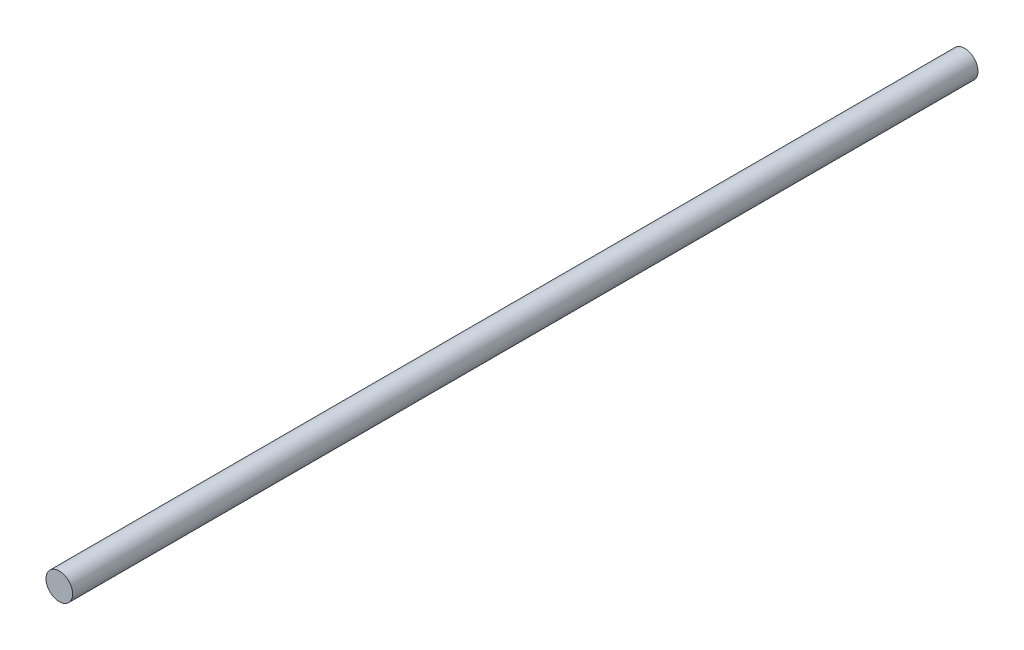
ISO-10303-21;
HEADER;
FILE_DESCRIPTION(('STEP AP214'),'2;1');
FILE_NAME('part.step','',(''),(''),'','','');
FILE_SCHEMA(('AUTOMOTIVE_DESIGN { 1 0 10303 214 1 1 1 1 }'));
ENDSEC;
DATA;
#1=APPLICATION_CONTEXT('core data for automotive mechanical design processes');
#2=APPLICATION_PROTOCOL_DEFINITION('international standard','automotive_design',2000,#1);
#3=PRODUCT_CONTEXT('',#1,'mechanical');
#4=PRODUCT('Part','Part','',(#3));
#5=PRODUCT_RELATED_PRODUCT_CATEGORY('part','',(#4));
#6=PRODUCT_DEFINITION_FORMATION('','',#4);
#7=PRODUCT_DEFINITION_CONTEXT('part definition',#1,'design');
#8=PRODUCT_DEFINITION('design','',#6,#7);
#9=PRODUCT_DEFINITION_SHAPE('','',#8);
#10=(LENGTH_UNIT() NAMED_UNIT(*) SI_UNIT(.MILLI.,.METRE.));
#11=(NAMED_UNIT(*) PLANE_ANGLE_UNIT() SI_UNIT($,.RADIAN.));
#12=(NAMED_UNIT(*) SI_UNIT($,.STERADIAN.) SOLID_ANGLE_UNIT());
#13=UNCERTAINTY_MEASURE_WITH_UNIT(LENGTH_MEASURE(1.E-05),#10,'distance_accuracy_value','');
#14=(GEOMETRIC_REPRESENTATION_CONTEXT(3) GLOBAL_UNCERTAINTY_ASSIGNED_CONTEXT((#13)) GLOBAL_UNIT_ASSIGNED_CONTEXT((#10,
#11,#12)) REPRESENTATION_CONTEXT('',''));
#15=CARTESIAN_POINT('',(0.,0.,0.));
#16=DIRECTION('',(0.,0.,1.));
#17=DIRECTION('',(1.,0.,0.));
#18=AXIS2_PLACEMENT_3D('',#15,#16,#17);
#19=CARTESIAN_POINT('',(0.,0.,170.));
#20=DIRECTION('',(0.,0.,-1.));
#21=DIRECTION('',(-1.,0.,0.));
#22=AXIS2_PLACEMENT_3D('',#19,#20,#21);
#23=CYLINDRICAL_SURFACE('',#22,2.5);
#24=CARTESIAN_POINT('',(0.,0.,170.));
#25=DIRECTION('',(0.,0.,1.));
#26=DIRECTION('',(1.,0.,0.));
#27=AXIS2_PLACEMENT_3D('',#24,#25,#26);
#28=CIRCLE('',#27,2.5);
#29=CARTESIAN_POINT('',(2.5,0.,170.));
#30=VERTEX_POINT('',#29);
#31=EDGE_CURVE('E10',#30,#30,#28,.T.);
#32=ORIENTED_EDGE('',*,*,#31,.F.);
#33=EDGE_LOOP('',(#32));
#34=FACE_BOUND('',#33,.T.);
#35=CARTESIAN_POINT('',(0.,0.,0.));
#36=DIRECTION('',(0.,0.,1.));
#37=DIRECTION('',(1.,0.,0.));
#38=AXIS2_PLACEMENT_3D('',#35,#36,#37);
#39=CIRCLE('',#38,2.5);
#40=CARTESIAN_POINT('',(2.5,0.,0.));
#41=VERTEX_POINT('',#40);
#42=EDGE_CURVE('E34',#41,#41,#39,.T.);
#43=ORIENTED_EDGE('',*,*,#42,.T.);
#44=EDGE_LOOP('',(#43));
#45=FACE_BOUND('',#44,.T.);
#46=ADVANCED_FACE('F31',(#34,#45),#23,.T.);
#47=CARTESIAN_POINT('',(0.,0.,170.));
#48=DIRECTION('',(0.,0.,1.));
#49=DIRECTION('',(1.,0.,0.));
#50=AXIS2_PLACEMENT_3D('',#47,#48,#49);
#51=PLANE('',#50);
#52=ORIENTED_EDGE('',*,*,#31,.T.);
#53=EDGE_LOOP('',(#52));
#54=FACE_BOUND('',#53,.T.);
#55=ADVANCED_FACE('F46',(#54),#51,.T.);
#56=CARTESIAN_POINT('',(0.,0.,0.));
#57=DIRECTION('',(0.,0.,1.));
#58=DIRECTION('',(1.,0.,0.));
#59=AXIS2_PLACEMENT_3D('',#56,#57,#58);
#60=PLANE('',#59);
#61=ORIENTED_EDGE('',*,*,#42,.F.);
#62=EDGE_LOOP('',(#61));
#63=FACE_BOUND('',#62,.T.);
#64=ADVANCED_FACE('F44',(#63),#60,.F.);
#65=CLOSED_SHELL('',(#46,#55,#64));
#66=MANIFOLD_SOLID_BREP('B2',#65);
#67=ADVANCED_BREP_SHAPE_REPRESENTATION('',(#18,#66),#14);
#68=SHAPE_DEFINITION_REPRESENTATION(#9,#67);
ENDSEC;
END-ISO-10303-21;
